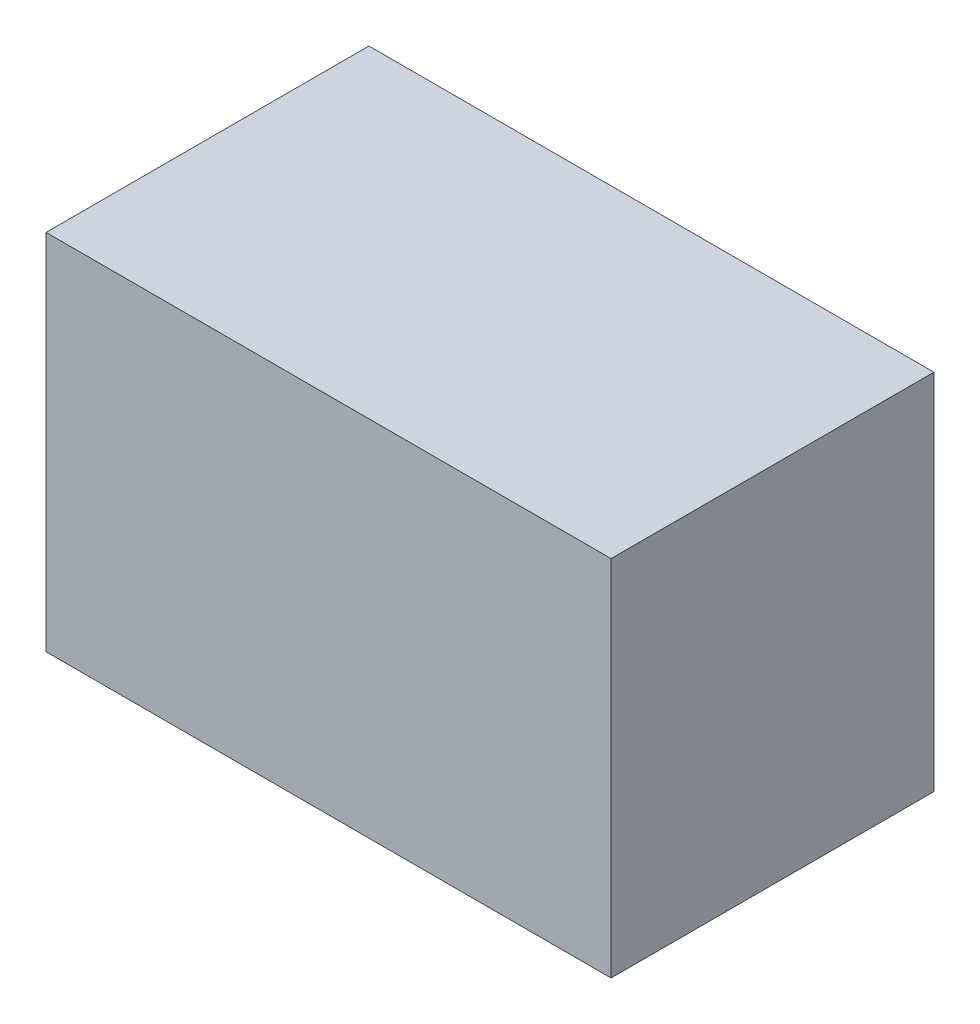
ISO-10303-21;
HEADER;
FILE_DESCRIPTION(('STEP AP214'),'2;1');
FILE_NAME('part.step','',(''),(''),'','','');
FILE_SCHEMA(('AUTOMOTIVE_DESIGN { 1 0 10303 214 1 1 1 1 }'));
ENDSEC;
DATA;
#1=APPLICATION_CONTEXT('core data for automotive mechanical design processes');
#2=APPLICATION_PROTOCOL_DEFINITION('international standard','automotive_design',2000,#1);
#3=PRODUCT_CONTEXT('',#1,'mechanical');
#4=PRODUCT('Part','Part','',(#3));
#5=PRODUCT_RELATED_PRODUCT_CATEGORY('part','',(#4));
#6=PRODUCT_DEFINITION_FORMATION('','',#4);
#7=PRODUCT_DEFINITION_CONTEXT('part definition',#1,'design');
#8=PRODUCT_DEFINITION('design','',#6,#7);
#9=PRODUCT_DEFINITION_SHAPE('','',#8);
#10=(LENGTH_UNIT() NAMED_UNIT(*) SI_UNIT(.MILLI.,.METRE.));
#11=(NAMED_UNIT(*) PLANE_ANGLE_UNIT() SI_UNIT($,.RADIAN.));
#12=(NAMED_UNIT(*) SI_UNIT($,.STERADIAN.) SOLID_ANGLE_UNIT());
#13=UNCERTAINTY_MEASURE_WITH_UNIT(LENGTH_MEASURE(1.E-05),#10,'distance_accuracy_value','');
#14=(GEOMETRIC_REPRESENTATION_CONTEXT(3) GLOBAL_UNCERTAINTY_ASSIGNED_CONTEXT((#13)) GLOBAL_UNIT_ASSIGNED_CONTEXT((#10,
#11,#12)) REPRESENTATION_CONTEXT('',''));
#15=CARTESIAN_POINT('',(0.,0.,0.));
#16=DIRECTION('',(0.,0.,1.));
#17=DIRECTION('',(1.,0.,0.));
#18=AXIS2_PLACEMENT_3D('',#15,#16,#17);
#19=CARTESIAN_POINT('',(-350.,-225.,400.));
#20=DIRECTION('',(0.,0.,1.));
#21=DIRECTION('',(1.,0.,0.));
#22=AXIS2_PLACEMENT_3D('',#19,#20,#21);
#23=PLANE('',#22);
#24=DIRECTION('',(0.,1.,0.));
#25=VECTOR('',#24,1.);
#26=CARTESIAN_POINT('',(-350.,-225.,400.));
#27=LINE('',#26,#25);
#28=CARTESIAN_POINT('',(-350.,-225.,400.));
#29=VERTEX_POINT('',#28);
#30=CARTESIAN_POINT('',(-350.,225.,400.));
#31=VERTEX_POINT('',#30);
#32=EDGE_CURVE('E149',#29,#31,#27,.T.);
#33=ORIENTED_EDGE('',*,*,#32,.F.);
#34=DIRECTION('',(1.,0.,0.));
#35=VECTOR('',#34,1.);
#36=CARTESIAN_POINT('',(-350.,-225.,400.));
#37=LINE('',#36,#35);
#38=CARTESIAN_POINT('',(350.,-225.,400.));
#39=VERTEX_POINT('',#38);
#40=EDGE_CURVE('E75',#29,#39,#37,.T.);
#41=ORIENTED_EDGE('',*,*,#40,.T.);
#42=DIRECTION('',(0.,1.,0.));
#43=VECTOR('',#42,1.);
#44=CARTESIAN_POINT('',(350.,-225.,400.));
#45=LINE('',#44,#43);
#46=CARTESIAN_POINT('',(350.,225.,400.));
#47=VERTEX_POINT('',#46);
#48=EDGE_CURVE('E87',#39,#47,#45,.T.);
#49=ORIENTED_EDGE('',*,*,#48,.T.);
#50=DIRECTION('',(1.,0.,0.));
#51=VECTOR('',#50,1.);
#52=CARTESIAN_POINT('',(-350.,225.,400.));
#53=LINE('',#52,#51);
#54=EDGE_CURVE('E11',#31,#47,#53,.T.);
#55=ORIENTED_EDGE('',*,*,#54,.F.);
#56=EDGE_LOOP('',(#33,#41,#49,#55));
#57=FACE_BOUND('',#56,.T.);
#58=ADVANCED_FACE('F17',(#57),#23,.T.);
#59=CARTESIAN_POINT('',(-350.,-225.,0.));
#60=DIRECTION('',(0.,0.,1.));
#61=DIRECTION('',(1.,0.,0.));
#62=AXIS2_PLACEMENT_3D('',#59,#60,#61);
#63=PLANE('',#62);
#64=DIRECTION('',(1.,0.,0.));
#65=VECTOR('',#64,1.);
#66=CARTESIAN_POINT('',(-350.,225.,0.));
#67=LINE('',#66,#65);
#68=CARTESIAN_POINT('',(-350.,225.,0.));
#69=VERTEX_POINT('',#68);
#70=CARTESIAN_POINT('',(350.,225.,0.));
#71=VERTEX_POINT('',#70);
#72=EDGE_CURVE('E25',#69,#71,#67,.T.);
#73=ORIENTED_EDGE('',*,*,#72,.T.);
#74=DIRECTION('',(0.,1.,0.));
#75=VECTOR('',#74,1.);
#76=CARTESIAN_POINT('',(350.,-225.,0.));
#77=LINE('',#76,#75);
#78=CARTESIAN_POINT('',(350.,-225.,0.));
#79=VERTEX_POINT('',#78);
#80=EDGE_CURVE('E78',#79,#71,#77,.T.);
#81=ORIENTED_EDGE('',*,*,#80,.F.);
#82=DIRECTION('',(1.,0.,0.));
#83=VECTOR('',#82,1.);
#84=CARTESIAN_POINT('',(-350.,-225.,0.));
#85=LINE('',#84,#83);
#86=CARTESIAN_POINT('',(-350.,-225.,0.));
#87=VERTEX_POINT('',#86);
#88=EDGE_CURVE('E66',#87,#79,#85,.T.);
#89=ORIENTED_EDGE('',*,*,#88,.F.);
#90=DIRECTION('',(0.,1.,0.));
#91=VECTOR('',#90,1.);
#92=CARTESIAN_POINT('',(-350.,-225.,0.));
#93=LINE('',#92,#91);
#94=EDGE_CURVE('E92',#87,#69,#93,.T.);
#95=ORIENTED_EDGE('',*,*,#94,.T.);
#96=EDGE_LOOP('',(#73,#81,#89,#95));
#97=FACE_BOUND('',#96,.T.);
#98=ADVANCED_FACE('F79',(#97),#63,.F.);
#99=CARTESIAN_POINT('',(-350.,225.,0.));
#100=DIRECTION('',(0.,1.,0.));
#101=DIRECTION('',(1.,0.,0.));
#102=AXIS2_PLACEMENT_3D('',#99,#100,#101);
#103=PLANE('',#102);
#104=ORIENTED_EDGE('',*,*,#72,.F.);
#105=DIRECTION('',(0.,0.,1.));
#106=VECTOR('',#105,1.);
#107=CARTESIAN_POINT('',(-350.,225.,0.));
#108=LINE('',#107,#106);
#109=EDGE_CURVE('E151',#69,#31,#108,.T.);
#110=ORIENTED_EDGE('',*,*,#109,.T.);
#111=ORIENTED_EDGE('',*,*,#54,.T.);
#112=DIRECTION('',(0.,0.,1.));
#113=VECTOR('',#112,1.);
#114=CARTESIAN_POINT('',(350.,225.,0.));
#115=LINE('',#114,#113);
#116=EDGE_CURVE('E83',#71,#47,#115,.T.);
#117=ORIENTED_EDGE('',*,*,#116,.F.);
#118=EDGE_LOOP('',(#104,#110,#111,#117));
#119=FACE_BOUND('',#118,.T.);
#120=ADVANCED_FACE('F124',(#119),#103,.T.);
#121=CARTESIAN_POINT('',(-350.,-225.,0.));
#122=DIRECTION('',(0.,1.,0.));
#123=DIRECTION('',(1.,0.,0.));
#124=AXIS2_PLACEMENT_3D('',#121,#122,#123);
#125=PLANE('',#124);
#126=DIRECTION('',(0.,0.,1.));
#127=VECTOR('',#126,1.);
#128=CARTESIAN_POINT('',(350.,-225.,0.));
#129=LINE('',#128,#127);
#130=EDGE_CURVE('E70',#79,#39,#129,.T.);
#131=ORIENTED_EDGE('',*,*,#130,.T.);
#132=ORIENTED_EDGE('',*,*,#40,.F.);
#133=DIRECTION('',(0.,0.,1.));
#134=VECTOR('',#133,1.);
#135=CARTESIAN_POINT('',(-350.,-225.,0.));
#136=LINE('',#135,#134);
#137=EDGE_CURVE('E72',#87,#29,#136,.T.);
#138=ORIENTED_EDGE('',*,*,#137,.F.);
#139=ORIENTED_EDGE('',*,*,#88,.T.);
#140=EDGE_LOOP('',(#131,#132,#138,#139));
#141=FACE_BOUND('',#140,.T.);
#142=ADVANCED_FACE('F67',(#141),#125,.F.);
#143=CARTESIAN_POINT('',(350.,-225.,0.));
#144=DIRECTION('',(1.,0.,0.));
#145=DIRECTION('',(0.,-1.,0.));
#146=AXIS2_PLACEMENT_3D('',#143,#144,#145);
#147=PLANE('',#146);
#148=ORIENTED_EDGE('',*,*,#130,.F.);
#149=ORIENTED_EDGE('',*,*,#80,.T.);
#150=ORIENTED_EDGE('',*,*,#116,.T.);
#151=ORIENTED_EDGE('',*,*,#48,.F.);
#152=EDGE_LOOP('',(#148,#149,#150,#151));
#153=FACE_BOUND('',#152,.T.);
#154=ADVANCED_FACE('F86',(#153),#147,.T.);
#155=CARTESIAN_POINT('',(-350.,-225.,0.));
#156=DIRECTION('',(1.,0.,0.));
#157=DIRECTION('',(0.,-1.,0.));
#158=AXIS2_PLACEMENT_3D('',#155,#156,#157);
#159=PLANE('',#158);
#160=ORIENTED_EDGE('',*,*,#32,.T.);
#161=ORIENTED_EDGE('',*,*,#109,.F.);
#162=ORIENTED_EDGE('',*,*,#94,.F.);
#163=ORIENTED_EDGE('',*,*,#137,.T.);
#164=EDGE_LOOP('',(#160,#161,#162,#163));
#165=FACE_BOUND('',#164,.T.);
#166=ADVANCED_FACE('F105',(#165),#159,.F.);
#167=CLOSED_SHELL('',(#58,#98,#120,#142,#154,#166));
#168=MANIFOLD_SOLID_BREP('B1',#167);
#169=ADVANCED_BREP_SHAPE_REPRESENTATION('',(#18,#168),#14);
#170=SHAPE_DEFINITION_REPRESENTATION(#9,#169);
ENDSEC;
END-ISO-10303-21;
